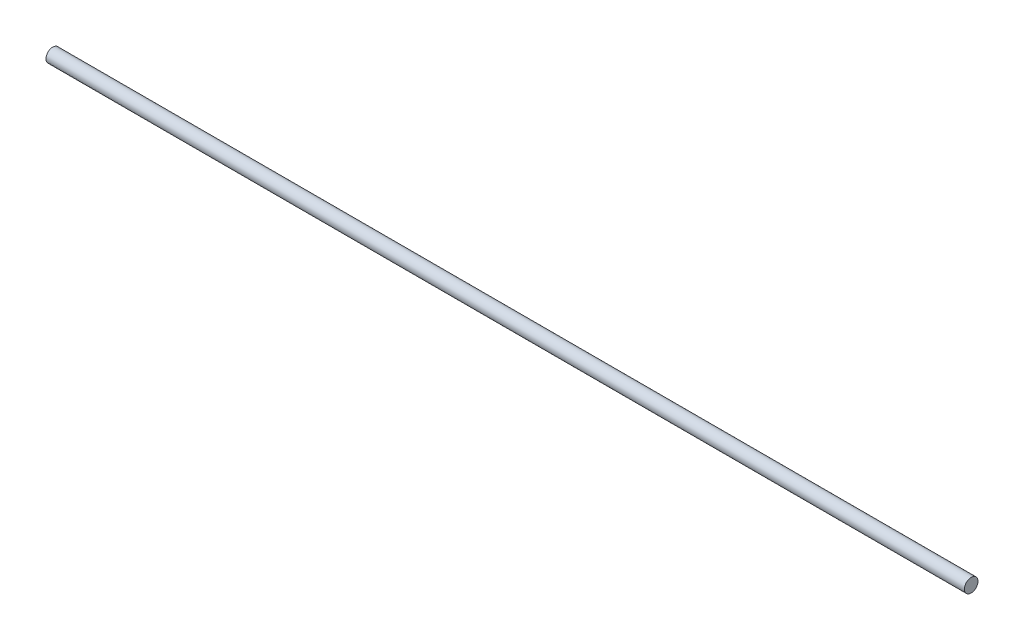
ISO-10303-21;
HEADER;
FILE_DESCRIPTION(('STEP AP214'),'2;1');
FILE_NAME('part.step','',(''),(''),'','','');
FILE_SCHEMA(('AUTOMOTIVE_DESIGN { 1 0 10303 214 1 1 1 1 }'));
ENDSEC;
DATA;
#1=APPLICATION_CONTEXT('core data for automotive mechanical design processes');
#2=APPLICATION_PROTOCOL_DEFINITION('international standard','automotive_design',2000,#1);
#3=PRODUCT_CONTEXT('',#1,'mechanical');
#4=PRODUCT('Part','Part','',(#3));
#5=PRODUCT_RELATED_PRODUCT_CATEGORY('part','',(#4));
#6=PRODUCT_DEFINITION_FORMATION('','',#4);
#7=PRODUCT_DEFINITION_CONTEXT('part definition',#1,'design');
#8=PRODUCT_DEFINITION('design','',#6,#7);
#9=PRODUCT_DEFINITION_SHAPE('','',#8);
#10=(LENGTH_UNIT() NAMED_UNIT(*) SI_UNIT(.MILLI.,.METRE.));
#11=(NAMED_UNIT(*) PLANE_ANGLE_UNIT() SI_UNIT($,.RADIAN.));
#12=(NAMED_UNIT(*) SI_UNIT($,.STERADIAN.) SOLID_ANGLE_UNIT());
#13=UNCERTAINTY_MEASURE_WITH_UNIT(LENGTH_MEASURE(1.E-05),#10,'distance_accuracy_value','');
#14=(GEOMETRIC_REPRESENTATION_CONTEXT(3) GLOBAL_UNCERTAINTY_ASSIGNED_CONTEXT((#13)) GLOBAL_UNIT_ASSIGNED_CONTEXT((#10,
#11,#12)) REPRESENTATION_CONTEXT('',''));
#15=CARTESIAN_POINT('',(0.,0.,0.));
#16=DIRECTION('',(0.,0.,1.));
#17=DIRECTION('',(1.,0.,0.));
#18=AXIS2_PLACEMENT_3D('',#15,#16,#17);
#19=CARTESIAN_POINT('',(338.,0.,0.));
#20=DIRECTION('',(-1.,0.,0.));
#21=DIRECTION('',(0.,0.,1.));
#22=AXIS2_PLACEMENT_3D('',#19,#20,#21);
#23=CYLINDRICAL_SURFACE('',#22,5.);
#24=CARTESIAN_POINT('',(338.,0.,0.));
#25=DIRECTION('',(1.,0.,0.));
#26=DIRECTION('',(0.,0.,-1.));
#27=AXIS2_PLACEMENT_3D('',#24,#25,#26);
#28=CIRCLE('',#27,5.);
#29=CARTESIAN_POINT('',(338.,0.,-5.));
#30=VERTEX_POINT('',#29);
#31=EDGE_CURVE('E10',#30,#30,#28,.T.);
#32=ORIENTED_EDGE('',*,*,#31,.F.);
#33=EDGE_LOOP('',(#32));
#34=FACE_BOUND('',#33,.T.);
#35=CARTESIAN_POINT('',(-338.,0.,0.));
#36=DIRECTION('',(1.,0.,0.));
#37=DIRECTION('',(0.,0.,-1.));
#38=AXIS2_PLACEMENT_3D('',#35,#36,#37);
#39=CIRCLE('',#38,5.);
#40=CARTESIAN_POINT('',(-338.,0.,-5.));
#41=VERTEX_POINT('',#40);
#42=EDGE_CURVE('E34',#41,#41,#39,.T.);
#43=ORIENTED_EDGE('',*,*,#42,.T.);
#44=EDGE_LOOP('',(#43));
#45=FACE_BOUND('',#44,.T.);
#46=ADVANCED_FACE('F31',(#34,#45),#23,.T.);
#47=CARTESIAN_POINT('',(338.,0.,0.));
#48=DIRECTION('',(1.,0.,0.));
#49=DIRECTION('',(0.,0.,-1.));
#50=AXIS2_PLACEMENT_3D('',#47,#48,#49);
#51=PLANE('',#50);
#52=ORIENTED_EDGE('',*,*,#31,.T.);
#53=EDGE_LOOP('',(#52));
#54=FACE_BOUND('',#53,.T.);
#55=ADVANCED_FACE('F46',(#54),#51,.T.);
#56=CARTESIAN_POINT('',(-338.,0.,0.));
#57=DIRECTION('',(1.,0.,0.));
#58=DIRECTION('',(0.,0.,-1.));
#59=AXIS2_PLACEMENT_3D('',#56,#57,#58);
#60=PLANE('',#59);
#61=ORIENTED_EDGE('',*,*,#42,.F.);
#62=EDGE_LOOP('',(#61));
#63=FACE_BOUND('',#62,.T.);
#64=ADVANCED_FACE('F44',(#63),#60,.F.);
#65=CLOSED_SHELL('',(#46,#55,#64));
#66=MANIFOLD_SOLID_BREP('B2',#65);
#67=ADVANCED_BREP_SHAPE_REPRESENTATION('',(#18,#66),#14);
#68=SHAPE_DEFINITION_REPRESENTATION(#9,#67);
ENDSEC;
END-ISO-10303-21;
